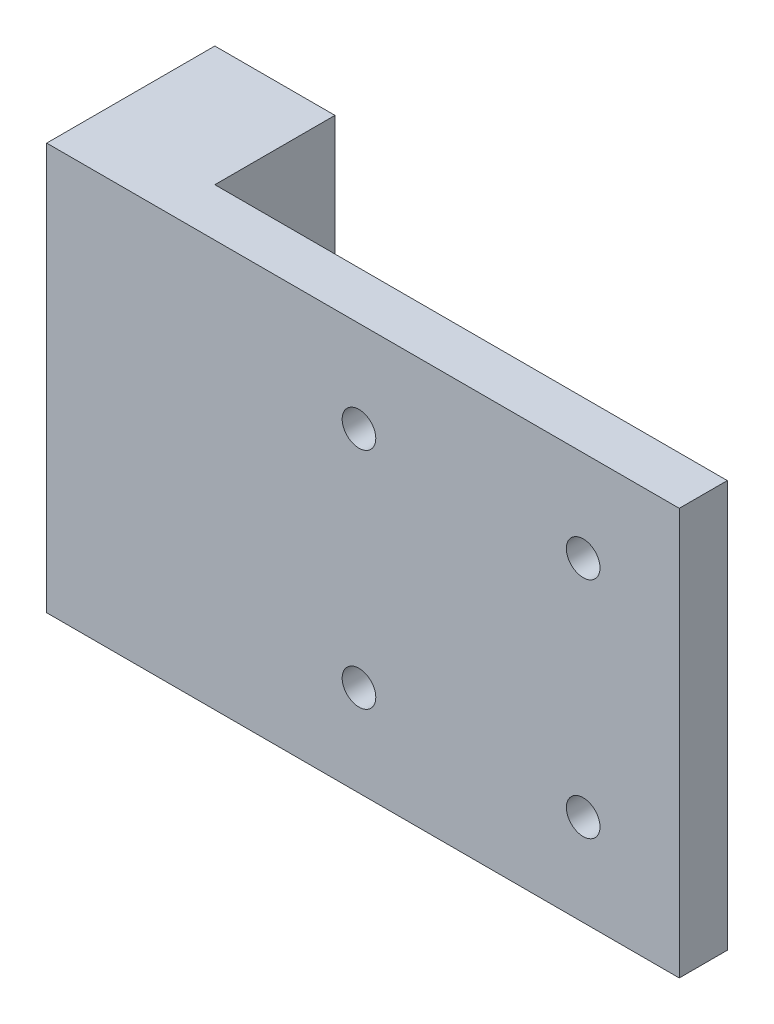
ISO-10303-21;
HEADER;
FILE_DESCRIPTION(('STEP AP214'),'2;1');
FILE_NAME('part.step','',(''),(''),'','','');
FILE_SCHEMA(('AUTOMOTIVE_DESIGN { 1 0 10303 214 1 1 1 1 }'));
ENDSEC;
DATA;
#1=APPLICATION_CONTEXT('core data for automotive mechanical design processes');
#2=APPLICATION_PROTOCOL_DEFINITION('international standard','automotive_design',2000,#1);
#3=PRODUCT_CONTEXT('',#1,'mechanical');
#4=PRODUCT('Part','Part','',(#3));
#5=PRODUCT_RELATED_PRODUCT_CATEGORY('part','',(#4));
#6=PRODUCT_DEFINITION_FORMATION('','',#4);
#7=PRODUCT_DEFINITION_CONTEXT('part definition',#1,'design');
#8=PRODUCT_DEFINITION('design','',#6,#7);
#9=PRODUCT_DEFINITION_SHAPE('','',#8);
#10=(LENGTH_UNIT() NAMED_UNIT(*) SI_UNIT(.MILLI.,.METRE.));
#11=(NAMED_UNIT(*) PLANE_ANGLE_UNIT() SI_UNIT($,.RADIAN.));
#12=(NAMED_UNIT(*) SI_UNIT($,.STERADIAN.) SOLID_ANGLE_UNIT());
#13=UNCERTAINTY_MEASURE_WITH_UNIT(LENGTH_MEASURE(1.E-05),#10,'distance_accuracy_value','');
#14=(GEOMETRIC_REPRESENTATION_CONTEXT(3) GLOBAL_UNCERTAINTY_ASSIGNED_CONTEXT((#13)) GLOBAL_UNIT_ASSIGNED_CONTEXT((#10,
#11,#12)) REPRESENTATION_CONTEXT('',''));
#15=CARTESIAN_POINT('',(0.,0.,0.));
#16=DIRECTION('',(0.,0.,1.));
#17=DIRECTION('',(1.,0.,0.));
#18=AXIS2_PLACEMENT_3D('',#15,#16,#17);
#19=CARTESIAN_POINT('',(0.,0.,6.));
#20=DIRECTION('',(0.,0.,-1.));
#21=DIRECTION('',(-1.,0.,0.));
#22=AXIS2_PLACEMENT_3D('',#19,#20,#21);
#23=PLANE('',#22);
#24=DIRECTION('',(0.,-1.,0.));
#25=VECTOR('',#24,1.);
#26=CARTESIAN_POINT('',(0.,0.,6.));
#27=LINE('',#26,#25);
#28=CARTESIAN_POINT('',(0.,50.8,6.));
#29=VERTEX_POINT('',#28);
#30=CARTESIAN_POINT('',(0.,0.,6.));
#31=VERTEX_POINT('',#30);
#32=EDGE_CURVE('E146',#29,#31,#27,.T.);
#33=ORIENTED_EDGE('',*,*,#32,.T.);
#34=DIRECTION('',(1.,0.,0.));
#35=VECTOR('',#34,1.);
#36=CARTESIAN_POINT('',(0.,0.,6.));
#37=LINE('',#36,#35);
#38=CARTESIAN_POINT('',(79.,0.,6.));
#39=VERTEX_POINT('',#38);
#40=EDGE_CURVE('E80',#31,#39,#37,.T.);
#41=ORIENTED_EDGE('',*,*,#40,.T.);
#42=DIRECTION('',(0.,1.,0.));
#43=VECTOR('',#42,1.);
#44=CARTESIAN_POINT('',(79.,0.,6.));
#45=LINE('',#44,#43);
#46=CARTESIAN_POINT('',(79.,50.8,6.));
#47=VERTEX_POINT('',#46);
#48=EDGE_CURVE('E150',#39,#47,#45,.T.);
#49=ORIENTED_EDGE('',*,*,#48,.T.);
#50=DIRECTION('',(-1.,0.,0.));
#51=VECTOR('',#50,1.);
#52=CARTESIAN_POINT('',(0.,50.8,6.));
#53=LINE('',#52,#51);
#54=EDGE_CURVE('E57',#47,#29,#53,.T.);
#55=ORIENTED_EDGE('',*,*,#54,.T.);
#56=EDGE_LOOP('',(#33,#41,#49,#55));
#57=FACE_BOUND('',#56,.T.);
#58=CARTESIAN_POINT('',(67.,39.4,6.));
#59=DIRECTION('',(0.,0.,1.));
#60=DIRECTION('',(1.,0.,0.));
#61=AXIS2_PLACEMENT_3D('',#58,#59,#60);
#62=CIRCLE('',#61,2.1);
#63=CARTESIAN_POINT('',(69.1,39.4,6.));
#64=VERTEX_POINT('',#63);
#65=EDGE_CURVE('E140',#64,#64,#62,.T.);
#66=ORIENTED_EDGE('',*,*,#65,.F.);
#67=EDGE_LOOP('',(#66));
#68=FACE_BOUND('',#67,.T.);
#69=CARTESIAN_POINT('',(67.,11.4,6.));
#70=DIRECTION('',(0.,0.,1.));
#71=DIRECTION('',(1.,0.,0.));
#72=AXIS2_PLACEMENT_3D('',#69,#70,#71);
#73=CIRCLE('',#72,2.1);
#74=CARTESIAN_POINT('',(69.1,11.4,6.));
#75=VERTEX_POINT('',#74);
#76=EDGE_CURVE('E134',#75,#75,#73,.T.);
#77=ORIENTED_EDGE('',*,*,#76,.F.);
#78=EDGE_LOOP('',(#77));
#79=FACE_BOUND('',#78,.T.);
#80=CARTESIAN_POINT('',(39.,11.4,6.));
#81=DIRECTION('',(0.,0.,1.));
#82=DIRECTION('',(1.,0.,0.));
#83=AXIS2_PLACEMENT_3D('',#80,#81,#82);
#84=CIRCLE('',#83,2.1);
#85=CARTESIAN_POINT('',(41.1,11.4,6.));
#86=VERTEX_POINT('',#85);
#87=EDGE_CURVE('E128',#86,#86,#84,.T.);
#88=ORIENTED_EDGE('',*,*,#87,.F.);
#89=EDGE_LOOP('',(#88));
#90=FACE_BOUND('',#89,.T.);
#91=CARTESIAN_POINT('',(39.,39.4,6.));
#92=DIRECTION('',(0.,0.,1.));
#93=DIRECTION('',(1.,0.,0.));
#94=AXIS2_PLACEMENT_3D('',#91,#92,#93);
#95=CIRCLE('',#94,2.1);
#96=CARTESIAN_POINT('',(41.1,39.4,6.));
#97=VERTEX_POINT('',#96);
#98=EDGE_CURVE('E120',#97,#97,#95,.T.);
#99=ORIENTED_EDGE('',*,*,#98,.F.);
#100=EDGE_LOOP('',(#99));
#101=FACE_BOUND('',#100,.T.);
#102=ADVANCED_FACE('F33',(#57,#68,#79,#90,#101),#23,.F.);
#103=CARTESIAN_POINT('',(0.,0.,0.));
#104=DIRECTION('',(0.,0.,-1.));
#105=DIRECTION('',(-1.,0.,0.));
#106=AXIS2_PLACEMENT_3D('',#103,#104,#105);
#107=PLANE('',#106);
#108=DIRECTION('',(0.,-1.,0.));
#109=VECTOR('',#108,1.);
#110=CARTESIAN_POINT('',(15.,50.8,0.));
#111=LINE('',#110,#109);
#112=CARTESIAN_POINT('',(15.,50.8,0.));
#113=VERTEX_POINT('',#112);
#114=CARTESIAN_POINT('',(15.,0.,0.));
#115=VERTEX_POINT('',#114);
#116=EDGE_CURVE('E48',#113,#115,#111,.T.);
#117=ORIENTED_EDGE('',*,*,#116,.F.);
#118=DIRECTION('',(-1.,0.,0.));
#119=VECTOR('',#118,1.);
#120=CARTESIAN_POINT('',(0.,50.8,0.));
#121=LINE('',#120,#119);
#122=CARTESIAN_POINT('',(79.,50.8,0.));
#123=VERTEX_POINT('',#122);
#124=EDGE_CURVE('E148',#123,#113,#121,.T.);
#125=ORIENTED_EDGE('',*,*,#124,.F.);
#126=DIRECTION('',(0.,1.,0.));
#127=VECTOR('',#126,1.);
#128=CARTESIAN_POINT('',(79.,0.,0.));
#129=LINE('',#128,#127);
#130=CARTESIAN_POINT('',(79.,0.,0.));
#131=VERTEX_POINT('',#130);
#132=EDGE_CURVE('E73',#131,#123,#129,.T.);
#133=ORIENTED_EDGE('',*,*,#132,.F.);
#134=DIRECTION('',(1.,0.,0.));
#135=VECTOR('',#134,1.);
#136=CARTESIAN_POINT('',(0.,0.,0.));
#137=LINE('',#136,#135);
#138=EDGE_CURVE('E143',#115,#131,#137,.T.);
#139=ORIENTED_EDGE('',*,*,#138,.F.);
#140=EDGE_LOOP('',(#117,#125,#133,#139));
#141=FACE_BOUND('',#140,.T.);
#142=CARTESIAN_POINT('',(39.,11.4,0.));
#143=DIRECTION('',(0.,0.,1.));
#144=DIRECTION('',(1.,0.,0.));
#145=AXIS2_PLACEMENT_3D('',#142,#143,#144);
#146=CIRCLE('',#145,2.1);
#147=CARTESIAN_POINT('',(41.1,11.4,0.));
#148=VERTEX_POINT('',#147);
#149=EDGE_CURVE('E126',#148,#148,#146,.T.);
#150=ORIENTED_EDGE('',*,*,#149,.T.);
#151=EDGE_LOOP('',(#150));
#152=FACE_BOUND('',#151,.T.);
#153=CARTESIAN_POINT('',(67.,39.4,0.));
#154=DIRECTION('',(0.,0.,1.));
#155=DIRECTION('',(1.,0.,0.));
#156=AXIS2_PLACEMENT_3D('',#153,#154,#155);
#157=CIRCLE('',#156,2.1);
#158=CARTESIAN_POINT('',(69.1,39.4,0.));
#159=VERTEX_POINT('',#158);
#160=EDGE_CURVE('E137',#159,#159,#157,.T.);
#161=ORIENTED_EDGE('',*,*,#160,.T.);
#162=EDGE_LOOP('',(#161));
#163=FACE_BOUND('',#162,.T.);
#164=CARTESIAN_POINT('',(67.,11.4,0.));
#165=DIRECTION('',(0.,0.,1.));
#166=DIRECTION('',(1.,0.,0.));
#167=AXIS2_PLACEMENT_3D('',#164,#165,#166);
#168=CIRCLE('',#167,2.1);
#169=CARTESIAN_POINT('',(69.1,11.4,0.));
#170=VERTEX_POINT('',#169);
#171=EDGE_CURVE('E131',#170,#170,#168,.T.);
#172=ORIENTED_EDGE('',*,*,#171,.T.);
#173=EDGE_LOOP('',(#172));
#174=FACE_BOUND('',#173,.T.);
#175=CARTESIAN_POINT('',(39.,39.4,0.));
#176=DIRECTION('',(0.,0.,1.));
#177=DIRECTION('',(1.,0.,0.));
#178=AXIS2_PLACEMENT_3D('',#175,#176,#177);
#179=CIRCLE('',#178,2.1);
#180=CARTESIAN_POINT('',(41.1,39.4,0.));
#181=VERTEX_POINT('',#180);
#182=EDGE_CURVE('E116',#181,#181,#179,.T.);
#183=ORIENTED_EDGE('',*,*,#182,.T.);
#184=EDGE_LOOP('',(#183));
#185=FACE_BOUND('',#184,.T.);
#186=ADVANCED_FACE('F161',(#141,#152,#163,#174,#185),#107,.T.);
#187=CARTESIAN_POINT('',(0.,0.,6.));
#188=DIRECTION('',(1.,0.,0.));
#189=DIRECTION('',(0.,0.,-1.));
#190=AXIS2_PLACEMENT_3D('',#187,#188,#189);
#191=PLANE('',#190);
#192=DIRECTION('',(0.,0.,-1.));
#193=VECTOR('',#192,1.);
#194=CARTESIAN_POINT('',(0.,50.8,6.));
#195=LINE('',#194,#193);
#196=CARTESIAN_POINT('',(0.,50.8,-15.));
#197=VERTEX_POINT('',#196);
#198=EDGE_CURVE('E153',#29,#197,#195,.T.);
#199=ORIENTED_EDGE('',*,*,#198,.T.);
#200=DIRECTION('',(0.,1.,0.));
#201=VECTOR('',#200,1.);
#202=CARTESIAN_POINT('',(0.,50.8,-15.));
#203=LINE('',#202,#201);
#204=CARTESIAN_POINT('',(0.,0.,-15.));
#205=VERTEX_POINT('',#204);
#206=EDGE_CURVE('E104',#205,#197,#203,.T.);
#207=ORIENTED_EDGE('',*,*,#206,.F.);
#208=DIRECTION('',(0.,0.,-1.));
#209=VECTOR('',#208,1.);
#210=CARTESIAN_POINT('',(0.,0.,6.));
#211=LINE('',#210,#209);
#212=EDGE_CURVE('E11',#31,#205,#211,.T.);
#213=ORIENTED_EDGE('',*,*,#212,.F.);
#214=ORIENTED_EDGE('',*,*,#32,.F.);
#215=EDGE_LOOP('',(#199,#207,#213,#214));
#216=FACE_BOUND('',#215,.T.);
#217=ADVANCED_FACE('F35',(#216),#191,.F.);
#218=CARTESIAN_POINT('',(0.,0.,6.));
#219=DIRECTION('',(0.,1.,0.));
#220=DIRECTION('',(0.,0.,1.));
#221=AXIS2_PLACEMENT_3D('',#218,#219,#220);
#222=PLANE('',#221);
#223=ORIENTED_EDGE('',*,*,#212,.T.);
#224=DIRECTION('',(-1.,0.,0.));
#225=VECTOR('',#224,1.);
#226=CARTESIAN_POINT('',(15.,0.,-15.));
#227=LINE('',#226,#225);
#228=CARTESIAN_POINT('',(15.,0.,-15.));
#229=VERTEX_POINT('',#228);
#230=EDGE_CURVE('E95',#229,#205,#227,.T.);
#231=ORIENTED_EDGE('',*,*,#230,.F.);
#232=DIRECTION('',(0.,0.,1.));
#233=VECTOR('',#232,1.);
#234=CARTESIAN_POINT('',(15.,0.,-15.));
#235=LINE('',#234,#233);
#236=EDGE_CURVE('E99',#229,#115,#235,.T.);
#237=ORIENTED_EDGE('',*,*,#236,.T.);
#238=ORIENTED_EDGE('',*,*,#138,.T.);
#239=DIRECTION('',(0.,0.,-1.));
#240=VECTOR('',#239,1.);
#241=CARTESIAN_POINT('',(79.,0.,6.));
#242=LINE('',#241,#240);
#243=EDGE_CURVE('E41',#39,#131,#242,.T.);
#244=ORIENTED_EDGE('',*,*,#243,.F.);
#245=ORIENTED_EDGE('',*,*,#40,.F.);
#246=EDGE_LOOP('',(#223,#231,#237,#238,#244,#245));
#247=FACE_BOUND('',#246,.T.);
#248=ADVANCED_FACE('F97',(#247),#222,.F.);
#249=CARTESIAN_POINT('',(79.,0.,6.));
#250=DIRECTION('',(-1.,0.,0.));
#251=DIRECTION('',(0.,0.,1.));
#252=AXIS2_PLACEMENT_3D('',#249,#250,#251);
#253=PLANE('',#252);
#254=ORIENTED_EDGE('',*,*,#132,.T.);
#255=DIRECTION('',(0.,0.,-1.));
#256=VECTOR('',#255,1.);
#257=CARTESIAN_POINT('',(79.,50.8,6.));
#258=LINE('',#257,#256);
#259=EDGE_CURVE('E158',#47,#123,#258,.T.);
#260=ORIENTED_EDGE('',*,*,#259,.F.);
#261=ORIENTED_EDGE('',*,*,#48,.F.);
#262=ORIENTED_EDGE('',*,*,#243,.T.);
#263=EDGE_LOOP('',(#254,#260,#261,#262));
#264=FACE_BOUND('',#263,.T.);
#265=ADVANCED_FACE('F160',(#264),#253,.F.);
#266=CARTESIAN_POINT('',(0.,50.8,6.));
#267=DIRECTION('',(0.,-1.,0.));
#268=DIRECTION('',(0.,0.,-1.));
#269=AXIS2_PLACEMENT_3D('',#266,#267,#268);
#270=PLANE('',#269);
#271=ORIENTED_EDGE('',*,*,#124,.T.);
#272=DIRECTION('',(0.,0.,1.));
#273=VECTOR('',#272,1.);
#274=CARTESIAN_POINT('',(15.,50.8,-15.));
#275=LINE('',#274,#273);
#276=CARTESIAN_POINT('',(15.,50.8,-15.));
#277=VERTEX_POINT('',#276);
#278=EDGE_CURVE('E117',#277,#113,#275,.T.);
#279=ORIENTED_EDGE('',*,*,#278,.F.);
#280=DIRECTION('',(1.,0.,0.));
#281=VECTOR('',#280,1.);
#282=CARTESIAN_POINT('',(15.,50.8,-15.));
#283=LINE('',#282,#281);
#284=EDGE_CURVE('E110',#197,#277,#283,.T.);
#285=ORIENTED_EDGE('',*,*,#284,.F.);
#286=ORIENTED_EDGE('',*,*,#198,.F.);
#287=ORIENTED_EDGE('',*,*,#54,.F.);
#288=ORIENTED_EDGE('',*,*,#259,.T.);
#289=EDGE_LOOP('',(#271,#279,#285,#286,#287,#288));
#290=FACE_BOUND('',#289,.T.);
#291=ADVANCED_FACE('F164',(#290),#270,.F.);
#292=CARTESIAN_POINT('',(67.,39.4,6.));
#293=DIRECTION('',(0.,0.,-1.));
#294=DIRECTION('',(-1.,0.,0.));
#295=AXIS2_PLACEMENT_3D('',#292,#293,#294);
#296=CYLINDRICAL_SURFACE('',#295,2.1);
#297=ORIENTED_EDGE('',*,*,#65,.T.);
#298=EDGE_LOOP('',(#297));
#299=FACE_BOUND('',#298,.T.);
#300=ORIENTED_EDGE('',*,*,#160,.F.);
#301=EDGE_LOOP('',(#300));
#302=FACE_BOUND('',#301,.T.);
#303=ADVANCED_FACE('F194',(#299,#302),#296,.F.);
#304=CARTESIAN_POINT('',(67.,11.4,6.));
#305=DIRECTION('',(0.,0.,-1.));
#306=DIRECTION('',(-1.,0.,0.));
#307=AXIS2_PLACEMENT_3D('',#304,#305,#306);
#308=CYLINDRICAL_SURFACE('',#307,2.1);
#309=ORIENTED_EDGE('',*,*,#76,.T.);
#310=EDGE_LOOP('',(#309));
#311=FACE_BOUND('',#310,.T.);
#312=ORIENTED_EDGE('',*,*,#171,.F.);
#313=EDGE_LOOP('',(#312));
#314=FACE_BOUND('',#313,.T.);
#315=ADVANCED_FACE('F217',(#311,#314),#308,.F.);
#316=CARTESIAN_POINT('',(39.,11.4,6.));
#317=DIRECTION('',(0.,0.,-1.));
#318=DIRECTION('',(-1.,0.,0.));
#319=AXIS2_PLACEMENT_3D('',#316,#317,#318);
#320=CYLINDRICAL_SURFACE('',#319,2.1);
#321=ORIENTED_EDGE('',*,*,#87,.T.);
#322=EDGE_LOOP('',(#321));
#323=FACE_BOUND('',#322,.T.);
#324=ORIENTED_EDGE('',*,*,#149,.F.);
#325=EDGE_LOOP('',(#324));
#326=FACE_BOUND('',#325,.T.);
#327=ADVANCED_FACE('F181',(#323,#326),#320,.F.);
#328=CARTESIAN_POINT('',(39.,39.4,6.));
#329=DIRECTION('',(0.,0.,-1.));
#330=DIRECTION('',(-1.,0.,0.));
#331=AXIS2_PLACEMENT_3D('',#328,#329,#330);
#332=CYLINDRICAL_SURFACE('',#331,2.1);
#333=ORIENTED_EDGE('',*,*,#98,.T.);
#334=EDGE_LOOP('',(#333));
#335=FACE_BOUND('',#334,.T.);
#336=ORIENTED_EDGE('',*,*,#182,.F.);
#337=EDGE_LOOP('',(#336));
#338=FACE_BOUND('',#337,.T.);
#339=ADVANCED_FACE('F178',(#335,#338),#332,.F.);
#340=CARTESIAN_POINT('',(15.,50.8,-15.));
#341=DIRECTION('',(-1.,0.,0.));
#342=DIRECTION('',(0.,-1.,0.));
#343=AXIS2_PLACEMENT_3D('',#340,#341,#342);
#344=PLANE('',#343);
#345=ORIENTED_EDGE('',*,*,#116,.T.);
#346=ORIENTED_EDGE('',*,*,#236,.F.);
#347=DIRECTION('',(0.,-1.,0.));
#348=VECTOR('',#347,1.);
#349=CARTESIAN_POINT('',(15.,50.8,-15.));
#350=LINE('',#349,#348);
#351=EDGE_CURVE('E105',#277,#229,#350,.T.);
#352=ORIENTED_EDGE('',*,*,#351,.F.);
#353=ORIENTED_EDGE('',*,*,#278,.T.);
#354=EDGE_LOOP('',(#345,#346,#352,#353));
#355=FACE_BOUND('',#354,.T.);
#356=ADVANCED_FACE('F115',(#355),#344,.F.);
#357=CARTESIAN_POINT('',(0.,0.,-15.));
#358=DIRECTION('',(0.,0.,-1.));
#359=DIRECTION('',(-1.,0.,0.));
#360=AXIS2_PLACEMENT_3D('',#357,#358,#359);
#361=PLANE('',#360);
#362=ORIENTED_EDGE('',*,*,#351,.T.);
#363=ORIENTED_EDGE('',*,*,#230,.T.);
#364=ORIENTED_EDGE('',*,*,#206,.T.);
#365=ORIENTED_EDGE('',*,*,#284,.T.);
#366=EDGE_LOOP('',(#362,#363,#364,#365));
#367=FACE_BOUND('',#366,.T.);
#368=ADVANCED_FACE('F108',(#367),#361,.T.);
#369=CLOSED_SHELL('',(#102,#186,#217,#248,#265,#291,#303,#315,#327,#339,#356,#368));
#370=MANIFOLD_SOLID_BREP('B2',#369);
#371=ADVANCED_BREP_SHAPE_REPRESENTATION('',(#18,#370),#14);
#372=SHAPE_DEFINITION_REPRESENTATION(#9,#371);
ENDSEC;
END-ISO-10303-21;
